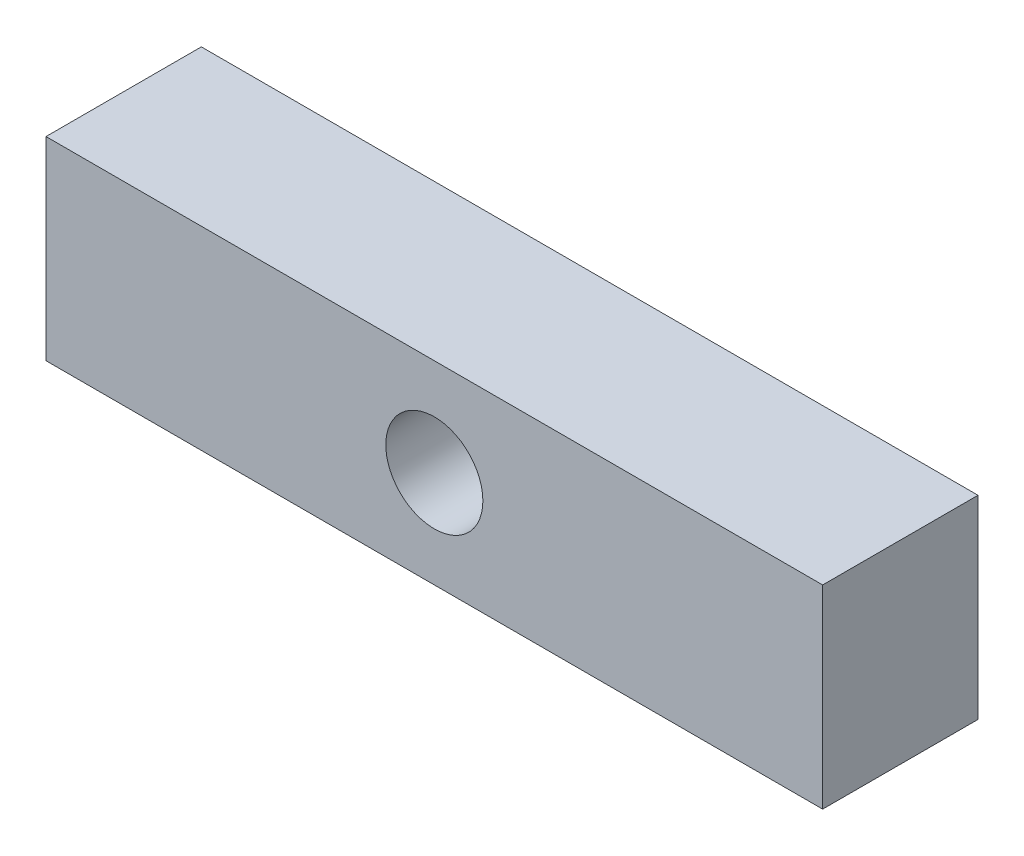
ISO-10303-21;
HEADER;
FILE_DESCRIPTION(('STEP AP214'),'2;1');
FILE_NAME('part.step','',(''),(''),'','','');
FILE_SCHEMA(('AUTOMOTIVE_DESIGN { 1 0 10303 214 1 1 1 1 }'));
ENDSEC;
DATA;
#1=APPLICATION_CONTEXT('core data for automotive mechanical design processes');
#2=APPLICATION_PROTOCOL_DEFINITION('international standard','automotive_design',2000,#1);
#3=PRODUCT_CONTEXT('',#1,'mechanical');
#4=PRODUCT('Part','Part','',(#3));
#5=PRODUCT_RELATED_PRODUCT_CATEGORY('part','',(#4));
#6=PRODUCT_DEFINITION_FORMATION('','',#4);
#7=PRODUCT_DEFINITION_CONTEXT('part definition',#1,'design');
#8=PRODUCT_DEFINITION('design','',#6,#7);
#9=PRODUCT_DEFINITION_SHAPE('','',#8);
#10=(LENGTH_UNIT() NAMED_UNIT(*) SI_UNIT(.MILLI.,.METRE.));
#11=(NAMED_UNIT(*) PLANE_ANGLE_UNIT() SI_UNIT($,.RADIAN.));
#12=(NAMED_UNIT(*) SI_UNIT($,.STERADIAN.) SOLID_ANGLE_UNIT());
#13=UNCERTAINTY_MEASURE_WITH_UNIT(LENGTH_MEASURE(1.E-05),#10,'distance_accuracy_value','');
#14=(GEOMETRIC_REPRESENTATION_CONTEXT(3) GLOBAL_UNCERTAINTY_ASSIGNED_CONTEXT((#13)) GLOBAL_UNIT_ASSIGNED_CONTEXT((#10,
#11,#12)) REPRESENTATION_CONTEXT('',''));
#15=CARTESIAN_POINT('',(0.,0.,0.));
#16=DIRECTION('',(0.,0.,1.));
#17=DIRECTION('',(1.,0.,0.));
#18=AXIS2_PLACEMENT_3D('',#15,#16,#17);
#19=CARTESIAN_POINT('',(0.,0.,8.));
#20=DIRECTION('',(0.,0.,1.));
#21=DIRECTION('',(1.,0.,0.));
#22=AXIS2_PLACEMENT_3D('',#19,#20,#21);
#23=PLANE('',#22);
#24=DIRECTION('',(0.,1.,0.));
#25=VECTOR('',#24,1.);
#26=CARTESIAN_POINT('',(20.,5.,8.));
#27=LINE('',#26,#25);
#28=CARTESIAN_POINT('',(20.,-5.,8.));
#29=VERTEX_POINT('',#28);
#30=CARTESIAN_POINT('',(20.,5.,8.));
#31=VERTEX_POINT('',#30);
#32=EDGE_CURVE('E92',#29,#31,#27,.T.);
#33=ORIENTED_EDGE('',*,*,#32,.T.);
#34=DIRECTION('',(-1.,0.,0.));
#35=VECTOR('',#34,1.);
#36=CARTESIAN_POINT('',(-20.,5.,8.));
#37=LINE('',#36,#35);
#38=CARTESIAN_POINT('',(-20.,5.,8.));
#39=VERTEX_POINT('',#38);
#40=EDGE_CURVE('E87',#31,#39,#37,.T.);
#41=ORIENTED_EDGE('',*,*,#40,.T.);
#42=DIRECTION('',(0.,-1.,0.));
#43=VECTOR('',#42,1.);
#44=CARTESIAN_POINT('',(-20.,5.,8.));
#45=LINE('',#44,#43);
#46=CARTESIAN_POINT('',(-20.,-5.,8.));
#47=VERTEX_POINT('',#46);
#48=EDGE_CURVE('E90',#39,#47,#45,.T.);
#49=ORIENTED_EDGE('',*,*,#48,.T.);
#50=DIRECTION('',(1.,0.,0.));
#51=VECTOR('',#50,1.);
#52=CARTESIAN_POINT('',(-20.,-5.,8.));
#53=LINE('',#52,#51);
#54=EDGE_CURVE('E57',#47,#29,#53,.T.);
#55=ORIENTED_EDGE('',*,*,#54,.T.);
#56=EDGE_LOOP('',(#33,#41,#49,#55));
#57=FACE_BOUND('',#56,.T.);
#58=CARTESIAN_POINT('',(0.,0.,8.));
#59=DIRECTION('',(0.,0.,1.));
#60=DIRECTION('',(1.,0.,0.));
#61=AXIS2_PLACEMENT_3D('',#58,#59,#60);
#62=CIRCLE('',#61,2.5);
#63=CARTESIAN_POINT('',(2.49999999999999,0.,8.));
#64=VERTEX_POINT('',#63);
#65=EDGE_CURVE('E112',#64,#64,#62,.T.);
#66=ORIENTED_EDGE('',*,*,#65,.F.);
#67=EDGE_LOOP('',(#66));
#68=FACE_BOUND('',#67,.T.);
#69=ADVANCED_FACE('F39',(#57,#68),#23,.T.);
#70=CARTESIAN_POINT('',(0.,0.,0.));
#71=DIRECTION('',(0.,0.,1.));
#72=DIRECTION('',(1.,0.,0.));
#73=AXIS2_PLACEMENT_3D('',#70,#71,#72);
#74=PLANE('',#73);
#75=DIRECTION('',(0.,1.,0.));
#76=VECTOR('',#75,1.);
#77=CARTESIAN_POINT('',(20.,5.,0.));
#78=LINE('',#77,#76);
#79=CARTESIAN_POINT('',(20.,-5.,0.));
#80=VERTEX_POINT('',#79);
#81=CARTESIAN_POINT('',(20.,5.,0.));
#82=VERTEX_POINT('',#81);
#83=EDGE_CURVE('E108',#80,#82,#78,.T.);
#84=ORIENTED_EDGE('',*,*,#83,.F.);
#85=DIRECTION('',(1.,0.,0.));
#86=VECTOR('',#85,1.);
#87=CARTESIAN_POINT('',(-20.,-5.,0.));
#88=LINE('',#87,#86);
#89=CARTESIAN_POINT('',(-20.,-5.,0.));
#90=VERTEX_POINT('',#89);
#91=EDGE_CURVE('E80',#90,#80,#88,.T.);
#92=ORIENTED_EDGE('',*,*,#91,.F.);
#93=DIRECTION('',(0.,-1.,0.));
#94=VECTOR('',#93,1.);
#95=CARTESIAN_POINT('',(-20.,5.,0.));
#96=LINE('',#95,#94);
#97=CARTESIAN_POINT('',(-20.,5.,0.));
#98=VERTEX_POINT('',#97);
#99=EDGE_CURVE('E74',#98,#90,#96,.T.);
#100=ORIENTED_EDGE('',*,*,#99,.F.);
#101=DIRECTION('',(-1.,0.,0.));
#102=VECTOR('',#101,1.);
#103=CARTESIAN_POINT('',(-20.,5.,0.));
#104=LINE('',#103,#102);
#105=EDGE_CURVE('E97',#82,#98,#104,.T.);
#106=ORIENTED_EDGE('',*,*,#105,.F.);
#107=EDGE_LOOP('',(#84,#92,#100,#106));
#108=FACE_BOUND('',#107,.T.);
#109=CARTESIAN_POINT('',(0.,0.,0.));
#110=DIRECTION('',(0.,0.,1.));
#111=DIRECTION('',(1.,0.,0.));
#112=AXIS2_PLACEMENT_3D('',#109,#110,#111);
#113=CIRCLE('',#112,2.5);
#114=CARTESIAN_POINT('',(2.49999999999999,0.,0.));
#115=VERTEX_POINT('',#114);
#116=EDGE_CURVE('E130',#115,#115,#113,.T.);
#117=ORIENTED_EDGE('',*,*,#116,.T.);
#118=EDGE_LOOP('',(#117));
#119=FACE_BOUND('',#118,.T.);
#120=ADVANCED_FACE('F125',(#108,#119),#74,.F.);
#121=CARTESIAN_POINT('',(20.,5.,8.));
#122=DIRECTION('',(-1.,0.,0.));
#123=DIRECTION('',(0.,-1.,0.));
#124=AXIS2_PLACEMENT_3D('',#121,#122,#123);
#125=PLANE('',#124);
#126=ORIENTED_EDGE('',*,*,#83,.T.);
#127=DIRECTION('',(0.,0.,-1.));
#128=VECTOR('',#127,1.);
#129=CARTESIAN_POINT('',(20.,5.,8.));
#130=LINE('',#129,#128);
#131=EDGE_CURVE('E11',#31,#82,#130,.T.);
#132=ORIENTED_EDGE('',*,*,#131,.F.);
#133=ORIENTED_EDGE('',*,*,#32,.F.);
#134=DIRECTION('',(0.,0.,-1.));
#135=VECTOR('',#134,1.);
#136=CARTESIAN_POINT('',(20.,-5.,8.));
#137=LINE('',#136,#135);
#138=EDGE_CURVE('E104',#29,#80,#137,.T.);
#139=ORIENTED_EDGE('',*,*,#138,.T.);
#140=EDGE_LOOP('',(#126,#132,#133,#139));
#141=FACE_BOUND('',#140,.T.);
#142=ADVANCED_FACE('F41',(#141),#125,.F.);
#143=CARTESIAN_POINT('',(-20.,5.,8.));
#144=DIRECTION('',(0.,-1.,0.));
#145=DIRECTION('',(1.,0.,0.));
#146=AXIS2_PLACEMENT_3D('',#143,#144,#145);
#147=PLANE('',#146);
#148=ORIENTED_EDGE('',*,*,#105,.T.);
#149=DIRECTION('',(0.,0.,-1.));
#150=VECTOR('',#149,1.);
#151=CARTESIAN_POINT('',(-20.,5.,8.));
#152=LINE('',#151,#150);
#153=EDGE_CURVE('E49',#39,#98,#152,.T.);
#154=ORIENTED_EDGE('',*,*,#153,.F.);
#155=ORIENTED_EDGE('',*,*,#40,.F.);
#156=ORIENTED_EDGE('',*,*,#131,.T.);
#157=EDGE_LOOP('',(#148,#154,#155,#156));
#158=FACE_BOUND('',#157,.T.);
#159=ADVANCED_FACE('F96',(#158),#147,.F.);
#160=CARTESIAN_POINT('',(-20.,5.,8.));
#161=DIRECTION('',(1.,0.,0.));
#162=DIRECTION('',(0.,0.,-1.));
#163=AXIS2_PLACEMENT_3D('',#160,#161,#162);
#164=PLANE('',#163);
#165=ORIENTED_EDGE('',*,*,#99,.T.);
#166=DIRECTION('',(0.,0.,-1.));
#167=VECTOR('',#166,1.);
#168=CARTESIAN_POINT('',(-20.,-5.,8.));
#169=LINE('',#168,#167);
#170=EDGE_CURVE('E99',#47,#90,#169,.T.);
#171=ORIENTED_EDGE('',*,*,#170,.F.);
#172=ORIENTED_EDGE('',*,*,#48,.F.);
#173=ORIENTED_EDGE('',*,*,#153,.T.);
#174=EDGE_LOOP('',(#165,#171,#172,#173));
#175=FACE_BOUND('',#174,.T.);
#176=ADVANCED_FACE('F100',(#175),#164,.F.);
#177=CARTESIAN_POINT('',(-20.,-5.,8.));
#178=DIRECTION('',(0.,1.,0.));
#179=DIRECTION('',(0.,0.,1.));
#180=AXIS2_PLACEMENT_3D('',#177,#178,#179);
#181=PLANE('',#180);
#182=ORIENTED_EDGE('',*,*,#91,.T.);
#183=ORIENTED_EDGE('',*,*,#138,.F.);
#184=ORIENTED_EDGE('',*,*,#54,.F.);
#185=ORIENTED_EDGE('',*,*,#170,.T.);
#186=EDGE_LOOP('',(#182,#183,#184,#185));
#187=FACE_BOUND('',#186,.T.);
#188=ADVANCED_FACE('F122',(#187),#181,.F.);
#189=CARTESIAN_POINT('',(0.,0.,8.));
#190=DIRECTION('',(0.,0.,-1.));
#191=DIRECTION('',(-1.,0.,0.));
#192=AXIS2_PLACEMENT_3D('',#189,#190,#191);
#193=CYLINDRICAL_SURFACE('',#192,2.5);
#194=ORIENTED_EDGE('',*,*,#65,.T.);
#195=EDGE_LOOP('',(#194));
#196=FACE_BOUND('',#195,.T.);
#197=ORIENTED_EDGE('',*,*,#116,.F.);
#198=EDGE_LOOP('',(#197));
#199=FACE_BOUND('',#198,.T.);
#200=ADVANCED_FACE('F138',(#196,#199),#193,.F.);
#201=CLOSED_SHELL('',(#69,#120,#142,#159,#176,#188,#200));
#202=MANIFOLD_SOLID_BREP('B2',#201);
#203=ADVANCED_BREP_SHAPE_REPRESENTATION('',(#18,#202),#14);
#204=SHAPE_DEFINITION_REPRESENTATION(#9,#203);
ENDSEC;
END-ISO-10303-21;
